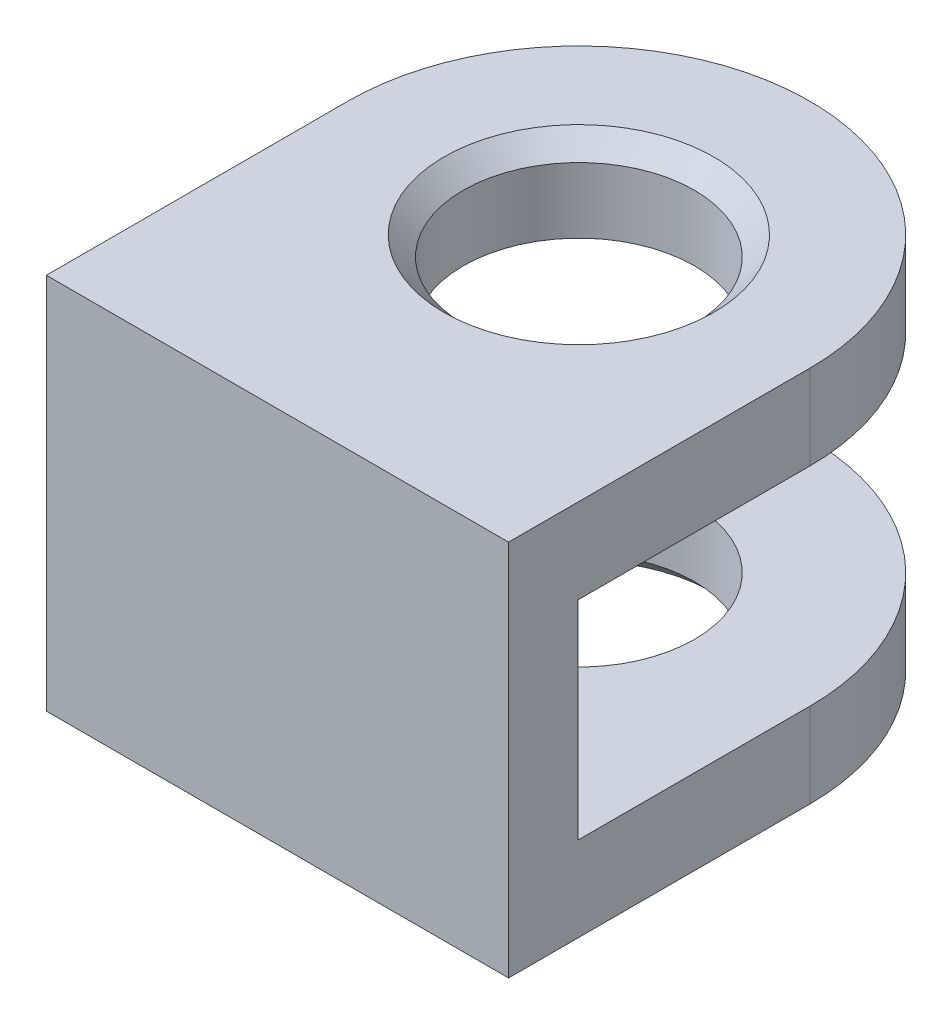
ISO-10303-21;
HEADER;
FILE_DESCRIPTION(('STEP AP214'),'2;1');
FILE_NAME('part.step','',(''),(''),'','','');
FILE_SCHEMA(('AUTOMOTIVE_DESIGN { 1 0 10303 214 1 1 1 1 }'));
ENDSEC;
DATA;
#1=APPLICATION_CONTEXT('core data for automotive mechanical design processes');
#2=APPLICATION_PROTOCOL_DEFINITION('international standard','automotive_design',2000,#1);
#3=PRODUCT_CONTEXT('',#1,'mechanical');
#4=PRODUCT('Part','Part','',(#3));
#5=PRODUCT_RELATED_PRODUCT_CATEGORY('part','',(#4));
#6=PRODUCT_DEFINITION_FORMATION('','',#4);
#7=PRODUCT_DEFINITION_CONTEXT('part definition',#1,'design');
#8=PRODUCT_DEFINITION('design','',#6,#7);
#9=PRODUCT_DEFINITION_SHAPE('','',#8);
#10=(LENGTH_UNIT() NAMED_UNIT(*) SI_UNIT(.MILLI.,.METRE.));
#11=(NAMED_UNIT(*) PLANE_ANGLE_UNIT() SI_UNIT($,.RADIAN.));
#12=(NAMED_UNIT(*) SI_UNIT($,.STERADIAN.) SOLID_ANGLE_UNIT());
#13=UNCERTAINTY_MEASURE_WITH_UNIT(LENGTH_MEASURE(1.E-05),#10,'distance_accuracy_value','');
#14=(GEOMETRIC_REPRESENTATION_CONTEXT(3) GLOBAL_UNCERTAINTY_ASSIGNED_CONTEXT((#13)) GLOBAL_UNIT_ASSIGNED_CONTEXT((#10,
#11,#12)) REPRESENTATION_CONTEXT('',''));
#15=CARTESIAN_POINT('',(0.,0.,0.));
#16=DIRECTION('',(0.,0.,1.));
#17=DIRECTION('',(1.,0.,0.));
#18=AXIS2_PLACEMENT_3D('',#15,#16,#17);
#19=CARTESIAN_POINT('',(0.,4.9,-7.825));
#20=DIRECTION('',(0.,-1.,0.));
#21=DIRECTION('',(0.,0.,-1.));
#22=AXIS2_PLACEMENT_3D('',#19,#20,#21);
#23=CYLINDRICAL_SURFACE('',#22,6.);
#24=CARTESIAN_POINT('',(0.,-2.7,-7.825));
#25=DIRECTION('',(0.,1.,0.));
#26=DIRECTION('',(0.,0.,1.));
#27=AXIS2_PLACEMENT_3D('',#24,#25,#26);
#28=CIRCLE('',#27,6.);
#29=CARTESIAN_POINT('',(6.,-2.7,-7.825));
#30=VERTEX_POINT('',#29);
#31=CARTESIAN_POINT('',(-6.,-2.7,-7.825));
#32=VERTEX_POINT('',#31);
#33=EDGE_CURVE('E117',#30,#32,#28,.T.);
#34=ORIENTED_EDGE('',*,*,#33,.F.);
#35=DIRECTION('',(0.,-1.,0.));
#36=VECTOR('',#35,1.);
#37=CARTESIAN_POINT('',(6.,4.9,-7.825));
#38=LINE('',#37,#36);
#39=CARTESIAN_POINT('',(6.,-4.9,-7.825));
#40=VERTEX_POINT('',#39);
#41=EDGE_CURVE('E85',#30,#40,#38,.T.);
#42=ORIENTED_EDGE('',*,*,#41,.T.);
#43=CARTESIAN_POINT('',(0.,-4.9,-7.825));
#44=DIRECTION('',(0.,1.,0.));
#45=DIRECTION('',(0.,0.,1.));
#46=AXIS2_PLACEMENT_3D('',#43,#44,#45);
#47=CIRCLE('',#46,6.);
#48=CARTESIAN_POINT('',(-6.,-4.9,-7.825));
#49=VERTEX_POINT('',#48);
#50=EDGE_CURVE('E157',#40,#49,#47,.T.);
#51=ORIENTED_EDGE('',*,*,#50,.T.);
#52=DIRECTION('',(0.,-1.,0.));
#53=VECTOR('',#52,1.);
#54=CARTESIAN_POINT('',(-6.,4.9,-7.825));
#55=LINE('',#54,#53);
#56=EDGE_CURVE('E126',#32,#49,#55,.T.);
#57=ORIENTED_EDGE('',*,*,#56,.F.);
#58=EDGE_LOOP('',(#34,#42,#51,#57));
#59=FACE_BOUND('',#58,.T.);
#60=ADVANCED_FACE('F38',(#59),#23,.T.);
#61=CARTESIAN_POINT('',(-6.,4.9,-7.825));
#62=DIRECTION('',(1.,0.,0.));
#63=DIRECTION('',(0.,0.,-1.));
#64=AXIS2_PLACEMENT_3D('',#61,#62,#63);
#65=PLANE('',#64);
#66=DIRECTION('',(0.,0.,1.));
#67=VECTOR('',#66,1.);
#68=CARTESIAN_POINT('',(-6.,-2.7,-7.825));
#69=LINE('',#68,#67);
#70=CARTESIAN_POINT('',(-6.,-2.7,-1.8));
#71=VERTEX_POINT('',#70);
#72=EDGE_CURVE('E127',#32,#71,#69,.T.);
#73=ORIENTED_EDGE('',*,*,#72,.F.);
#74=ORIENTED_EDGE('',*,*,#56,.T.);
#75=DIRECTION('',(0.,0.,1.));
#76=VECTOR('',#75,1.);
#77=CARTESIAN_POINT('',(-6.,-4.9,-7.825));
#78=LINE('',#77,#76);
#79=CARTESIAN_POINT('',(-6.,-4.9,0.));
#80=VERTEX_POINT('',#79);
#81=EDGE_CURVE('E219',#49,#80,#78,.T.);
#82=ORIENTED_EDGE('',*,*,#81,.T.);
#83=DIRECTION('',(0.,-1.,0.));
#84=VECTOR('',#83,1.);
#85=CARTESIAN_POINT('',(-6.,4.9,0.));
#86=LINE('',#85,#84);
#87=CARTESIAN_POINT('',(-6.,4.9,0.));
#88=VERTEX_POINT('',#87);
#89=EDGE_CURVE('E144',#88,#80,#86,.T.);
#90=ORIENTED_EDGE('',*,*,#89,.F.);
#91=DIRECTION('',(0.,0.,1.));
#92=VECTOR('',#91,1.);
#93=CARTESIAN_POINT('',(-6.,4.9,-7.825));
#94=LINE('',#93,#92);
#95=CARTESIAN_POINT('',(-6.,4.9,-7.825));
#96=VERTEX_POINT('',#95);
#97=EDGE_CURVE('E93',#96,#88,#94,.T.);
#98=ORIENTED_EDGE('',*,*,#97,.F.);
#99=CARTESIAN_POINT('',(-6.,2.7,-7.825));
#100=VERTEX_POINT('',#99);
#101=EDGE_CURVE('E147',#96,#100,#55,.T.);
#102=ORIENTED_EDGE('',*,*,#101,.T.);
#103=DIRECTION('',(0.,0.,1.));
#104=VECTOR('',#103,1.);
#105=CARTESIAN_POINT('',(-6.,2.7,-7.825));
#106=LINE('',#105,#104);
#107=CARTESIAN_POINT('',(-6.,2.7,-1.8));
#108=VERTEX_POINT('',#107);
#109=EDGE_CURVE('E204',#100,#108,#106,.T.);
#110=ORIENTED_EDGE('',*,*,#109,.T.);
#111=DIRECTION('',(0.,1.,0.));
#112=VECTOR('',#111,1.);
#113=CARTESIAN_POINT('',(-6.,-2.7,-1.8));
#114=LINE('',#113,#112);
#115=EDGE_CURVE('E213',#71,#108,#114,.T.);
#116=ORIENTED_EDGE('',*,*,#115,.F.);
#117=EDGE_LOOP('',(#73,#74,#82,#90,#98,#102,#110,#116));
#118=FACE_BOUND('',#117,.T.);
#119=ADVANCED_FACE('F178',(#118),#65,.F.);
#120=CARTESIAN_POINT('',(6.,4.9,0.));
#121=DIRECTION('',(-1.,0.,0.));
#122=DIRECTION('',(0.,0.,1.));
#123=AXIS2_PLACEMENT_3D('',#120,#121,#122);
#124=PLANE('',#123);
#125=DIRECTION('',(0.,0.,-1.));
#126=VECTOR('',#125,1.);
#127=CARTESIAN_POINT('',(6.,-2.7,-1.8));
#128=LINE('',#127,#126);
#129=CARTESIAN_POINT('',(6.,-2.7,-1.8));
#130=VERTEX_POINT('',#129);
#131=EDGE_CURVE('E115',#130,#30,#128,.T.);
#132=ORIENTED_EDGE('',*,*,#131,.F.);
#133=DIRECTION('',(0.,1.,0.));
#134=VECTOR('',#133,1.);
#135=CARTESIAN_POINT('',(6.,-2.7,-1.8));
#136=LINE('',#135,#134);
#137=CARTESIAN_POINT('',(6.,2.7,-1.8));
#138=VERTEX_POINT('',#137);
#139=EDGE_CURVE('E154',#130,#138,#136,.T.);
#140=ORIENTED_EDGE('',*,*,#139,.T.);
#141=DIRECTION('',(0.,0.,-1.));
#142=VECTOR('',#141,1.);
#143=CARTESIAN_POINT('',(6.,2.7,-1.8));
#144=LINE('',#143,#142);
#145=CARTESIAN_POINT('',(6.,2.7,-7.825));
#146=VERTEX_POINT('',#145);
#147=EDGE_CURVE('E200',#138,#146,#144,.T.);
#148=ORIENTED_EDGE('',*,*,#147,.T.);
#149=CARTESIAN_POINT('',(6.,4.9,-7.825));
#150=VERTEX_POINT('',#149);
#151=EDGE_CURVE('E134',#150,#146,#38,.T.);
#152=ORIENTED_EDGE('',*,*,#151,.F.);
#153=DIRECTION('',(0.,0.,-1.));
#154=VECTOR('',#153,1.);
#155=CARTESIAN_POINT('',(6.,4.9,0.));
#156=LINE('',#155,#154);
#157=CARTESIAN_POINT('',(6.,4.9,0.));
#158=VERTEX_POINT('',#157);
#159=EDGE_CURVE('E63',#158,#150,#156,.T.);
#160=ORIENTED_EDGE('',*,*,#159,.F.);
#161=DIRECTION('',(0.,-1.,0.));
#162=VECTOR('',#161,1.);
#163=CARTESIAN_POINT('',(6.,4.9,0.));
#164=LINE('',#163,#162);
#165=CARTESIAN_POINT('',(6.,-4.9,0.));
#166=VERTEX_POINT('',#165);
#167=EDGE_CURVE('E137',#158,#166,#164,.T.);
#168=ORIENTED_EDGE('',*,*,#167,.T.);
#169=DIRECTION('',(0.,0.,-1.));
#170=VECTOR('',#169,1.);
#171=CARTESIAN_POINT('',(6.,-4.9,0.));
#172=LINE('',#171,#170);
#173=EDGE_CURVE('E132',#166,#40,#172,.T.);
#174=ORIENTED_EDGE('',*,*,#173,.T.);
#175=ORIENTED_EDGE('',*,*,#41,.F.);
#176=EDGE_LOOP('',(#132,#140,#148,#152,#160,#168,#174,#175));
#177=FACE_BOUND('',#176,.T.);
#178=ADVANCED_FACE('F129',(#177),#124,.F.);
#179=CARTESIAN_POINT('',(0.,4.9,-7.825));
#180=DIRECTION('',(0.,-1.,0.));
#181=DIRECTION('',(0.,0.,-1.));
#182=AXIS2_PLACEMENT_3D('',#179,#180,#181);
#183=CYLINDRICAL_SURFACE('',#182,3.);
#184=CARTESIAN_POINT('',(0.,-4.4,-7.825));
#185=DIRECTION('',(0.,1.,0.));
#186=DIRECTION('',(0.,0.,1.));
#187=AXIS2_PLACEMENT_3D('',#184,#185,#186);
#188=CIRCLE('',#187,3.);
#189=CARTESIAN_POINT('',(0.,-4.4,-4.825));
#190=VERTEX_POINT('',#189);
#191=EDGE_CURVE('E11',#190,#190,#188,.F.);
#192=ORIENTED_EDGE('',*,*,#191,.T.);
#193=EDGE_LOOP('',(#192));
#194=FACE_BOUND('',#193,.T.);
#195=CARTESIAN_POINT('',(0.,-2.7,-7.825));
#196=DIRECTION('',(0.,1.,0.));
#197=DIRECTION('',(0.,0.,1.));
#198=AXIS2_PLACEMENT_3D('',#195,#196,#197);
#199=CIRCLE('',#198,3.);
#200=CARTESIAN_POINT('',(0.,-2.7,-4.825));
#201=VERTEX_POINT('',#200);
#202=EDGE_CURVE('E153',#201,#201,#199,.T.);
#203=ORIENTED_EDGE('',*,*,#202,.T.);
#204=EDGE_LOOP('',(#203));
#205=FACE_BOUND('',#204,.T.);
#206=ADVANCED_FACE('F242',(#194,#205),#183,.F.);
#207=CARTESIAN_POINT('',(0.,4.9,-7.825));
#208=DIRECTION('',(0.,1.,0.));
#209=DIRECTION('',(0.,0.,1.));
#210=AXIS2_PLACEMENT_3D('',#207,#208,#209);
#211=PLANE('',#210);
#212=CARTESIAN_POINT('',(0.,4.9,-7.825));
#213=DIRECTION('',(0.,1.,0.));
#214=DIRECTION('',(0.,0.,1.));
#215=AXIS2_PLACEMENT_3D('',#212,#213,#214);
#216=CIRCLE('',#215,3.50000000000001);
#217=CARTESIAN_POINT('',(0.,4.9,-4.32499999999999));
#218=VERTEX_POINT('',#217);
#219=EDGE_CURVE('E160',#218,#218,#216,.F.);
#220=ORIENTED_EDGE('',*,*,#219,.T.);
#221=EDGE_LOOP('',(#220));
#222=FACE_BOUND('',#221,.T.);
#223=CARTESIAN_POINT('',(0.,4.9,-7.825));
#224=DIRECTION('',(0.,1.,0.));
#225=DIRECTION('',(0.,0.,1.));
#226=AXIS2_PLACEMENT_3D('',#223,#224,#225);
#227=CIRCLE('',#226,6.);
#228=EDGE_CURVE('E199',#150,#96,#227,.T.);
#229=ORIENTED_EDGE('',*,*,#228,.T.);
#230=ORIENTED_EDGE('',*,*,#97,.T.);
#231=DIRECTION('',(1.,0.,0.));
#232=VECTOR('',#231,1.);
#233=CARTESIAN_POINT('',(-6.,4.9,0.));
#234=LINE('',#233,#232);
#235=EDGE_CURVE('E138',#88,#158,#234,.T.);
#236=ORIENTED_EDGE('',*,*,#235,.T.);
#237=ORIENTED_EDGE('',*,*,#159,.T.);
#238=EDGE_LOOP('',(#229,#230,#236,#237));
#239=FACE_BOUND('',#238,.T.);
#240=ADVANCED_FACE('F195',(#222,#239),#211,.T.);
#241=CARTESIAN_POINT('',(0.,-4.9,-7.825));
#242=DIRECTION('',(0.,1.,0.));
#243=DIRECTION('',(0.,0.,1.));
#244=AXIS2_PLACEMENT_3D('',#241,#242,#243);
#245=PLANE('',#244);
#246=CARTESIAN_POINT('',(0.,-4.9,-7.825));
#247=DIRECTION('',(0.,1.,0.));
#248=DIRECTION('',(0.,0.,1.));
#249=AXIS2_PLACEMENT_3D('',#246,#247,#248);
#250=CIRCLE('',#249,3.5);
#251=CARTESIAN_POINT('',(0.,-4.9,-4.325));
#252=VERTEX_POINT('',#251);
#253=EDGE_CURVE('E47',#252,#252,#250,.T.);
#254=ORIENTED_EDGE('',*,*,#253,.T.);
#255=EDGE_LOOP('',(#254));
#256=FACE_BOUND('',#255,.T.);
#257=ORIENTED_EDGE('',*,*,#50,.F.);
#258=ORIENTED_EDGE('',*,*,#173,.F.);
#259=DIRECTION('',(1.,0.,0.));
#260=VECTOR('',#259,1.);
#261=CARTESIAN_POINT('',(-6.,-4.9,0.));
#262=LINE('',#261,#260);
#263=EDGE_CURVE('E220',#80,#166,#262,.T.);
#264=ORIENTED_EDGE('',*,*,#263,.F.);
#265=ORIENTED_EDGE('',*,*,#81,.F.);
#266=EDGE_LOOP('',(#257,#258,#264,#265));
#267=FACE_BOUND('',#266,.T.);
#268=ADVANCED_FACE('F165',(#256,#267),#245,.F.);
#269=ORIENTED_EDGE('',*,*,#151,.T.);
#270=CARTESIAN_POINT('',(0.,2.7,-7.825));
#271=DIRECTION('',(0.,1.,0.));
#272=DIRECTION('',(0.,0.,1.));
#273=AXIS2_PLACEMENT_3D('',#270,#271,#272);
#274=CIRCLE('',#273,6.);
#275=EDGE_CURVE('E54',#146,#100,#274,.T.);
#276=ORIENTED_EDGE('',*,*,#275,.T.);
#277=ORIENTED_EDGE('',*,*,#101,.F.);
#278=ORIENTED_EDGE('',*,*,#228,.F.);
#279=EDGE_LOOP('',(#269,#276,#277,#278));
#280=FACE_BOUND('',#279,.T.);
#281=ADVANCED_FACE('F180',(#280),#23,.T.);
#282=CARTESIAN_POINT('',(-6.,4.9,0.));
#283=DIRECTION('',(0.,0.,-1.));
#284=DIRECTION('',(-1.,0.,0.));
#285=AXIS2_PLACEMENT_3D('',#282,#283,#284);
#286=PLANE('',#285);
#287=ORIENTED_EDGE('',*,*,#263,.T.);
#288=ORIENTED_EDGE('',*,*,#167,.F.);
#289=ORIENTED_EDGE('',*,*,#235,.F.);
#290=ORIENTED_EDGE('',*,*,#89,.T.);
#291=EDGE_LOOP('',(#287,#288,#289,#290));
#292=FACE_BOUND('',#291,.T.);
#293=ADVANCED_FACE('F186',(#292),#286,.F.);
#294=CARTESIAN_POINT('',(0.,4.4,-7.825));
#295=DIRECTION('',(0.,1.,0.));
#296=DIRECTION('',(0.,0.,1.));
#297=AXIS2_PLACEMENT_3D('',#294,#295,#296);
#298=CIRCLE('',#297,3.);
#299=CARTESIAN_POINT('',(0.,4.4,-4.825));
#300=VERTEX_POINT('',#299);
#301=EDGE_CURVE('E149',#300,#300,#298,.T.);
#302=ORIENTED_EDGE('',*,*,#301,.T.);
#303=EDGE_LOOP('',(#302));
#304=FACE_BOUND('',#303,.T.);
#305=CARTESIAN_POINT('',(0.,2.7,-7.825));
#306=DIRECTION('',(0.,1.,0.));
#307=DIRECTION('',(0.,0.,1.));
#308=AXIS2_PLACEMENT_3D('',#305,#306,#307);
#309=CIRCLE('',#308,3.);
#310=CARTESIAN_POINT('',(0.,2.7,-4.825));
#311=VERTEX_POINT('',#310);
#312=EDGE_CURVE('E150',#311,#311,#309,.T.);
#313=ORIENTED_EDGE('',*,*,#312,.F.);
#314=EDGE_LOOP('',(#313));
#315=FACE_BOUND('',#314,.T.);
#316=ADVANCED_FACE('F192',(#304,#315),#183,.F.);
#317=CARTESIAN_POINT('',(6.,-2.7,-1.8));
#318=DIRECTION('',(0.,0.,1.));
#319=DIRECTION('',(1.,0.,0.));
#320=AXIS2_PLACEMENT_3D('',#317,#318,#319);
#321=PLANE('',#320);
#322=DIRECTION('',(1.,0.,0.));
#323=VECTOR('',#322,1.);
#324=CARTESIAN_POINT('',(6.,2.7,-1.8));
#325=LINE('',#324,#323);
#326=EDGE_CURVE('E123',#108,#138,#325,.T.);
#327=ORIENTED_EDGE('',*,*,#326,.T.);
#328=ORIENTED_EDGE('',*,*,#139,.F.);
#329=DIRECTION('',(1.,0.,0.));
#330=VECTOR('',#329,1.);
#331=CARTESIAN_POINT('',(6.,-2.7,-1.8));
#332=LINE('',#331,#330);
#333=EDGE_CURVE('E120',#71,#130,#332,.T.);
#334=ORIENTED_EDGE('',*,*,#333,.F.);
#335=ORIENTED_EDGE('',*,*,#115,.T.);
#336=EDGE_LOOP('',(#327,#328,#334,#335));
#337=FACE_BOUND('',#336,.T.);
#338=ADVANCED_FACE('F227',(#337),#321,.F.);
#339=CARTESIAN_POINT('',(0.,-2.7,-7.825));
#340=DIRECTION('',(0.,1.,0.));
#341=DIRECTION('',(0.,0.,1.));
#342=AXIS2_PLACEMENT_3D('',#339,#340,#341);
#343=PLANE('',#342);
#344=ORIENTED_EDGE('',*,*,#202,.F.);
#345=EDGE_LOOP('',(#344));
#346=FACE_BOUND('',#345,.T.);
#347=ORIENTED_EDGE('',*,*,#131,.T.);
#348=ORIENTED_EDGE('',*,*,#33,.T.);
#349=ORIENTED_EDGE('',*,*,#72,.T.);
#350=ORIENTED_EDGE('',*,*,#333,.T.);
#351=EDGE_LOOP('',(#347,#348,#349,#350));
#352=FACE_BOUND('',#351,.T.);
#353=ADVANCED_FACE('F116',(#346,#352),#343,.T.);
#354=CARTESIAN_POINT('',(0.,2.7,-7.825));
#355=DIRECTION('',(0.,1.,0.));
#356=DIRECTION('',(0.,0.,1.));
#357=AXIS2_PLACEMENT_3D('',#354,#355,#356);
#358=PLANE('',#357);
#359=ORIENTED_EDGE('',*,*,#312,.T.);
#360=EDGE_LOOP('',(#359));
#361=FACE_BOUND('',#360,.T.);
#362=ORIENTED_EDGE('',*,*,#147,.F.);
#363=ORIENTED_EDGE('',*,*,#326,.F.);
#364=ORIENTED_EDGE('',*,*,#109,.F.);
#365=ORIENTED_EDGE('',*,*,#275,.F.);
#366=EDGE_LOOP('',(#362,#363,#364,#365));
#367=FACE_BOUND('',#366,.T.);
#368=ADVANCED_FACE('F174',(#361,#367),#358,.F.);
#369=CARTESIAN_POINT('',(0.,4.4,-7.825));
#370=DIRECTION('',(0.,1.,0.));
#371=DIRECTION('',(0.,0.,1.));
#372=AXIS2_PLACEMENT_3D('',#369,#370,#371);
#373=CONICAL_SURFACE('',#372,3.,0.785398163397453);
#374=ORIENTED_EDGE('',*,*,#219,.F.);
#375=EDGE_LOOP('',(#374));
#376=FACE_BOUND('',#375,.T.);
#377=ORIENTED_EDGE('',*,*,#301,.F.);
#378=EDGE_LOOP('',(#377));
#379=FACE_BOUND('',#378,.T.);
#380=ADVANCED_FACE('F169',(#376,#379),#373,.F.);
#381=CARTESIAN_POINT('',(0.,-4.9,-7.825));
#382=DIRECTION('',(0.,-1.,0.));
#383=DIRECTION('',(0.,0.,-1.));
#384=AXIS2_PLACEMENT_3D('',#381,#382,#383);
#385=CONICAL_SURFACE('',#384,3.5,0.785398163397447);
#386=ORIENTED_EDGE('',*,*,#191,.F.);
#387=EDGE_LOOP('',(#386));
#388=FACE_BOUND('',#387,.T.);
#389=ORIENTED_EDGE('',*,*,#253,.F.);
#390=EDGE_LOOP('',(#389));
#391=FACE_BOUND('',#390,.T.);
#392=ADVANCED_FACE('F41',(#388,#391),#385,.F.);
#393=CLOSED_SHELL('',(#60,#119,#178,#206,#240,#268,#281,#293,#316,#338,#353,#368,#380,#392));
#394=MANIFOLD_SOLID_BREP('B2',#393);
#395=ADVANCED_BREP_SHAPE_REPRESENTATION('',(#18,#394),#14);
#396=SHAPE_DEFINITION_REPRESENTATION(#9,#395);
ENDSEC;
END-ISO-10303-21;
